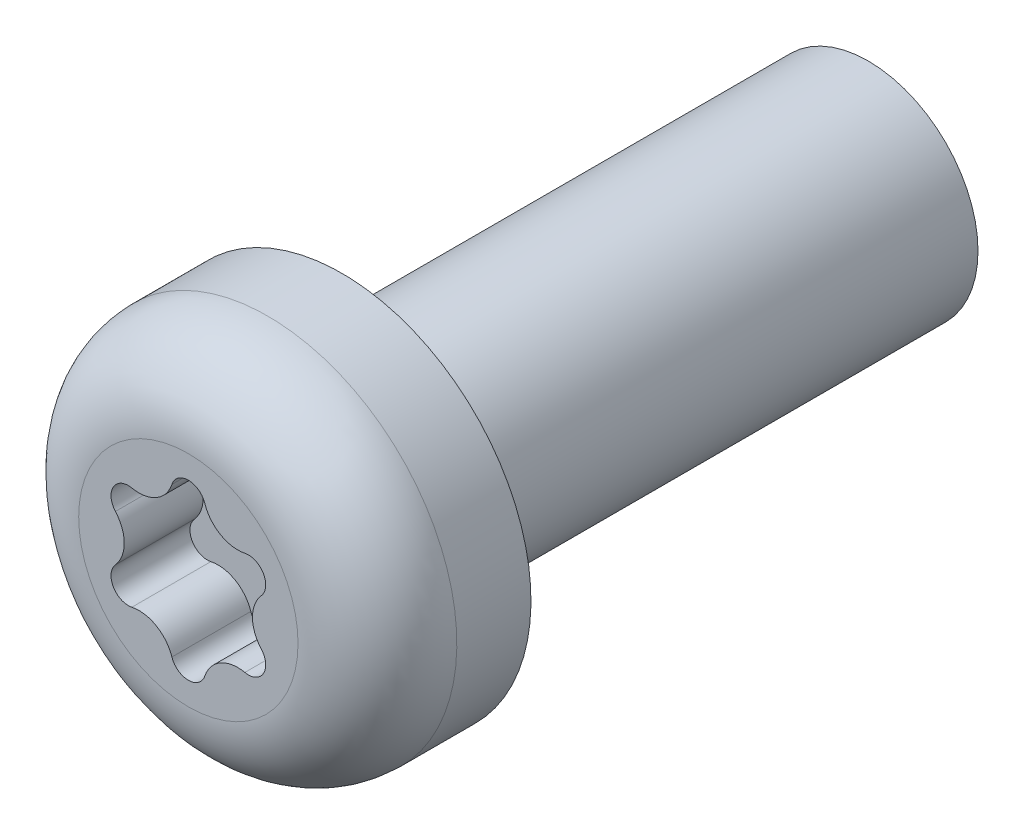
ISO-10303-21;
HEADER;
FILE_DESCRIPTION(('STEP AP214'),'2;1');
FILE_NAME('part.step','',(''),(''),'','','');
FILE_SCHEMA(('AUTOMOTIVE_DESIGN { 1 0 10303 214 1 1 1 1 }'));
ENDSEC;
DATA;
#1=APPLICATION_CONTEXT('core data for automotive mechanical design processes');
#2=APPLICATION_PROTOCOL_DEFINITION('international standard','automotive_design',2000,#1);
#3=PRODUCT_CONTEXT('',#1,'mechanical');
#4=PRODUCT('Part','Part','',(#3));
#5=PRODUCT_RELATED_PRODUCT_CATEGORY('part','',(#4));
#6=PRODUCT_DEFINITION_FORMATION('','',#4);
#7=PRODUCT_DEFINITION_CONTEXT('part definition',#1,'design');
#8=PRODUCT_DEFINITION('design','',#6,#7);
#9=PRODUCT_DEFINITION_SHAPE('','',#8);
#10=(LENGTH_UNIT() NAMED_UNIT(*) SI_UNIT(.MILLI.,.METRE.));
#11=(NAMED_UNIT(*) PLANE_ANGLE_UNIT() SI_UNIT($,.RADIAN.));
#12=(NAMED_UNIT(*) SI_UNIT($,.STERADIAN.) SOLID_ANGLE_UNIT());
#13=UNCERTAINTY_MEASURE_WITH_UNIT(LENGTH_MEASURE(1.E-05),#10,'distance_accuracy_value','');
#14=(GEOMETRIC_REPRESENTATION_CONTEXT(3) GLOBAL_UNCERTAINTY_ASSIGNED_CONTEXT((#13)) GLOBAL_UNIT_ASSIGNED_CONTEXT((#10,
#11,#12)) REPRESENTATION_CONTEXT('',''));
#15=CARTESIAN_POINT('',(0.,0.,0.));
#16=DIRECTION('',(0.,0.,1.));
#17=DIRECTION('',(1.,0.,0.));
#18=AXIS2_PLACEMENT_3D('',#15,#16,#17);
#19=CARTESIAN_POINT('',(0.,2.5,-12.));
#20=DIRECTION('',(0.,0.,1.));
#21=DIRECTION('',(0.,-1.,0.));
#22=AXIS2_PLACEMENT_3D('',#19,#20,#21);
#23=PLANE('',#22);
#24=CARTESIAN_POINT('',(0.,0.,-12.));
#25=DIRECTION('',(0.,0.,1.));
#26=DIRECTION('',(0.,-1.,0.));
#27=AXIS2_PLACEMENT_3D('',#24,#25,#26);
#28=CIRCLE('',#27,2.5);
#29=CARTESIAN_POINT('',(0.,-2.5,-12.));
#30=VERTEX_POINT('',#29);
#31=EDGE_CURVE('E11',#30,#30,#28,.T.);
#32=ORIENTED_EDGE('',*,*,#31,.F.);
#33=EDGE_LOOP('',(#32));
#34=FACE_BOUND('',#33,.T.);
#35=ADVANCED_FACE('F36',(#34),#23,.F.);
#36=CARTESIAN_POINT('',(0.,0.,5.58488227818494));
#37=DIRECTION('',(0.,0.,1.));
#38=DIRECTION('',(0.,-1.,0.));
#39=AXIS2_PLACEMENT_3D('',#36,#37,#38);
#40=CYLINDRICAL_SURFACE('',#39,2.5);
#41=CARTESIAN_POINT('',(0.,0.,0.));
#42=DIRECTION('',(0.,0.,1.));
#43=DIRECTION('',(0.,-1.,0.));
#44=AXIS2_PLACEMENT_3D('',#41,#42,#43);
#45=CIRCLE('',#44,2.5);
#46=CARTESIAN_POINT('',(0.,-2.5,0.));
#47=VERTEX_POINT('',#46);
#48=EDGE_CURVE('E44',#47,#47,#45,.T.);
#49=ORIENTED_EDGE('',*,*,#48,.F.);
#50=EDGE_LOOP('',(#49));
#51=FACE_BOUND('',#50,.T.);
#52=ORIENTED_EDGE('',*,*,#31,.T.);
#53=EDGE_LOOP('',(#52));
#54=FACE_BOUND('',#53,.T.);
#55=ADVANCED_FACE('F145',(#51,#54),#40,.T.);
#56=CARTESIAN_POINT('',(0.,4.31,0.));
#57=DIRECTION('',(0.,0.,1.));
#58=DIRECTION('',(0.,-1.,0.));
#59=AXIS2_PLACEMENT_3D('',#56,#57,#58);
#60=PLANE('',#59);
#61=CARTESIAN_POINT('',(0.,0.,0.));
#62=DIRECTION('',(0.,0.,1.));
#63=DIRECTION('',(0.,-1.,0.));
#64=AXIS2_PLACEMENT_3D('',#61,#62,#63);
#65=CIRCLE('',#64,4.31);
#66=CARTESIAN_POINT('',(0.,-4.31,0.));
#67=VERTEX_POINT('',#66);
#68=EDGE_CURVE('E138',#67,#67,#65,.T.);
#69=ORIENTED_EDGE('',*,*,#68,.F.);
#70=EDGE_LOOP('',(#69));
#71=FACE_BOUND('',#70,.T.);
#72=ORIENTED_EDGE('',*,*,#48,.T.);
#73=EDGE_LOOP('',(#72));
#74=FACE_BOUND('',#73,.T.);
#75=ADVANCED_FACE('F143',(#71,#74),#60,.F.);
#76=CARTESIAN_POINT('',(0.,0.,5.58488227818494));
#77=DIRECTION('',(0.,0.,1.));
#78=DIRECTION('',(0.,-1.,0.));
#79=AXIS2_PLACEMENT_3D('',#76,#77,#78);
#80=CYLINDRICAL_SURFACE('',#79,4.31);
#81=CARTESIAN_POINT('',(0.,0.,1.69));
#82=DIRECTION('',(0.,0.,1.));
#83=DIRECTION('',(0.,-1.,0.));
#84=AXIS2_PLACEMENT_3D('',#81,#82,#83);
#85=CIRCLE('',#84,4.31);
#86=CARTESIAN_POINT('',(0.,-4.31,1.69));
#87=VERTEX_POINT('',#86);
#88=EDGE_CURVE('E135',#87,#87,#85,.T.);
#89=ORIENTED_EDGE('',*,*,#88,.F.);
#90=EDGE_LOOP('',(#89));
#91=FACE_BOUND('',#90,.T.);
#92=ORIENTED_EDGE('',*,*,#68,.T.);
#93=EDGE_LOOP('',(#92));
#94=FACE_BOUND('',#93,.T.);
#95=ADVANCED_FACE('F163',(#91,#94),#80,.T.);
#96=CARTESIAN_POINT('',(0.,0.,1.69));
#97=DIRECTION('',(0.,0.,1.));
#98=DIRECTION('',(0.,-1.,0.));
#99=AXIS2_PLACEMENT_3D('',#96,#97,#98);
#100=TOROIDAL_SURFACE('',#99,2.5,1.81);
#101=CARTESIAN_POINT('',(0.,0.,3.5));
#102=DIRECTION('',(0.,0.,1.));
#103=DIRECTION('',(0.,-1.,0.));
#104=AXIS2_PLACEMENT_3D('',#101,#102,#103);
#105=CIRCLE('',#104,2.5);
#106=CARTESIAN_POINT('',(0.,-2.5,3.5));
#107=VERTEX_POINT('',#106);
#108=EDGE_CURVE('E131',#107,#107,#105,.T.);
#109=ORIENTED_EDGE('',*,*,#108,.F.);
#110=EDGE_LOOP('',(#109));
#111=FACE_BOUND('',#110,.T.);
#112=ORIENTED_EDGE('',*,*,#88,.T.);
#113=EDGE_LOOP('',(#112));
#114=FACE_BOUND('',#113,.T.);
#115=ADVANCED_FACE('F171',(#111,#114),#100,.T.);
#116=CARTESIAN_POINT('',(0.,0.,3.5));
#117=DIRECTION('',(0.,0.,-1.));
#118=DIRECTION('',(0.,1.,0.));
#119=AXIS2_PLACEMENT_3D('',#116,#117,#118);
#120=PLANE('',#119);
#121=CARTESIAN_POINT('',(-1.36832013797942,0.789999999999997,3.5));
#122=DIRECTION('',(0.,0.,1.));
#123=DIRECTION('',(-0.499999999999998,-0.86602540378444,0.));
#124=AXIS2_PLACEMENT_3D('',#121,#122,#123);
#125=CIRCLE('',#124,0.395);
#126=CARTESIAN_POINT('',(-1.28747459016825,1.17663807029199,3.5));
#127=VERTEX_POINT('',#126);
#128=CARTESIAN_POINT('',(-1.66273575501689,0.526666666666665,3.5));
#129=VERTEX_POINT('',#128);
#130=EDGE_CURVE('E95',#127,#129,#125,.T.);
#131=ORIENTED_EDGE('',*,*,#130,.F.);
#132=CARTESIAN_POINT('',(-1.12578349454591,1.94991421087597,3.5));
#133=DIRECTION('',(0.,0.,-1.));
#134=DIRECTION('',(1.,0.,0.));
#135=AXIS2_PLACEMENT_3D('',#132,#133,#134);
#136=CIRCLE('',#135,0.79);
#137=CARTESIAN_POINT('',(-0.375261164848638,1.70330473695866,3.5));
#138=VERTEX_POINT('',#137);
#139=EDGE_CURVE('E90',#138,#127,#136,.T.);
#140=ORIENTED_EDGE('',*,*,#139,.F.);
#141=CARTESIAN_POINT('',(0.,1.58,3.5));
#142=DIRECTION('',(0.,0.,1.));
#143=DIRECTION('',(-1.,0.,0.));
#144=AXIS2_PLACEMENT_3D('',#141,#142,#143);
#145=CIRCLE('',#144,0.395);
#146=CARTESIAN_POINT('',(0.375261164848638,1.70330473695866,3.5));
#147=VERTEX_POINT('',#146);
#148=EDGE_CURVE('E120',#147,#138,#145,.T.);
#149=ORIENTED_EDGE('',*,*,#148,.F.);
#150=CARTESIAN_POINT('',(1.12578349454591,1.94991421087597,3.5));
#151=DIRECTION('',(0.,0.,-1.));
#152=DIRECTION('',(1.,0.,0.));
#153=AXIS2_PLACEMENT_3D('',#150,#151,#152);
#154=CIRCLE('',#153,0.79);
#155=CARTESIAN_POINT('',(1.28747459016824,1.176638070292,3.5));
#156=VERTEX_POINT('',#155);
#157=EDGE_CURVE('E127',#156,#147,#154,.T.);
#158=ORIENTED_EDGE('',*,*,#157,.F.);
#159=CARTESIAN_POINT('',(1.3683201379794,0.790000000000016,3.5));
#160=DIRECTION('',(0.,0.,1.));
#161=DIRECTION('',(-0.50000000000001,0.866025403784433,0.));
#162=AXIS2_PLACEMENT_3D('',#159,#160,#161);
#163=CIRCLE('',#162,0.395);
#164=CARTESIAN_POINT('',(1.66273575501688,0.526666666666688,3.5));
#165=VERTEX_POINT('',#164);
#166=EDGE_CURVE('E353',#165,#156,#163,.T.);
#167=ORIENTED_EDGE('',*,*,#166,.F.);
#168=CARTESIAN_POINT('',(2.25156698909184,0.,3.5));
#169=DIRECTION('',(0.,0.,-1.));
#170=DIRECTION('',(-0.499999999999992,-0.866025403784443,0.));
#171=AXIS2_PLACEMENT_3D('',#168,#169,#170);
#172=CIRCLE('',#171,0.79);
#173=CARTESIAN_POINT('',(1.66273575501689,-0.526666666666654,3.5));
#174=VERTEX_POINT('',#173);
#175=EDGE_CURVE('E371',#174,#165,#172,.T.);
#176=ORIENTED_EDGE('',*,*,#175,.F.);
#177=CARTESIAN_POINT('',(1.36832013797942,-0.789999999999988,3.5));
#178=DIRECTION('',(0.,0.,1.));
#179=DIRECTION('',(0.499999999999992,0.866025403784443,0.));
#180=AXIS2_PLACEMENT_3D('',#177,#178,#179);
#181=CIRCLE('',#180,0.395);
#182=CARTESIAN_POINT('',(1.28747459016826,-1.17663807029198,3.5));
#183=VERTEX_POINT('',#182);
#184=EDGE_CURVE('E377',#183,#174,#181,.T.);
#185=ORIENTED_EDGE('',*,*,#184,.F.);
#186=CARTESIAN_POINT('',(1.12578349454591,-1.94991421087597,3.5));
#187=DIRECTION('',(0.,0.,-1.));
#188=DIRECTION('',(-1.,0.,0.));
#189=AXIS2_PLACEMENT_3D('',#186,#187,#188);
#190=CIRCLE('',#189,0.79);
#191=CARTESIAN_POINT('',(0.375261164848638,-1.70330473695866,3.5));
#192=VERTEX_POINT('',#191);
#193=EDGE_CURVE('E388',#192,#183,#190,.T.);
#194=ORIENTED_EDGE('',*,*,#193,.F.);
#195=CARTESIAN_POINT('',(0.,-1.58,3.5));
#196=DIRECTION('',(0.,0.,1.));
#197=DIRECTION('',(1.,0.,0.));
#198=AXIS2_PLACEMENT_3D('',#195,#196,#197);
#199=CIRCLE('',#198,0.395);
#200=CARTESIAN_POINT('',(-0.375261164848638,-1.70330473695866,3.5));
#201=VERTEX_POINT('',#200);
#202=EDGE_CURVE('E395',#201,#192,#199,.T.);
#203=ORIENTED_EDGE('',*,*,#202,.F.);
#204=CARTESIAN_POINT('',(-1.12578349454591,-1.94991421087597,3.5));
#205=DIRECTION('',(0.,0.,-1.));
#206=DIRECTION('',(-0.500000000000004,0.866025403784436,0.));
#207=AXIS2_PLACEMENT_3D('',#204,#205,#206);
#208=CIRCLE('',#207,0.79);
#209=CARTESIAN_POINT('',(-1.28747459016824,-1.176638070292,3.5));
#210=VERTEX_POINT('',#209);
#211=EDGE_CURVE('E406',#210,#201,#208,.T.);
#212=ORIENTED_EDGE('',*,*,#211,.F.);
#213=CARTESIAN_POINT('',(-1.36832013797941,-0.790000000000007,3.5));
#214=DIRECTION('',(0.,0.,1.));
#215=DIRECTION('',(0.500000000000004,-0.866025403784436,0.));
#216=AXIS2_PLACEMENT_3D('',#213,#214,#215);
#217=CIRCLE('',#216,0.395);
#218=CARTESIAN_POINT('',(-1.66273575501689,-0.526666666666677,3.5));
#219=VERTEX_POINT('',#218);
#220=EDGE_CURVE('E106',#219,#210,#217,.T.);
#221=ORIENTED_EDGE('',*,*,#220,.F.);
#222=CARTESIAN_POINT('',(-2.25156698909184,0.,3.5));
#223=DIRECTION('',(0.,0.,-1.));
#224=DIRECTION('',(0.499999999999998,0.86602540378444,0.));
#225=AXIS2_PLACEMENT_3D('',#222,#223,#224);
#226=CIRCLE('',#225,0.79);
#227=EDGE_CURVE('E85',#129,#219,#226,.T.);
#228=ORIENTED_EDGE('',*,*,#227,.F.);
#229=EDGE_LOOP('',(#131,#140,#149,#158,#167,#176,#185,#194,#203,#212,#221,#228));
#230=FACE_BOUND('',#229,.T.);
#231=ORIENTED_EDGE('',*,*,#108,.T.);
#232=EDGE_LOOP('',(#231));
#233=FACE_BOUND('',#232,.T.);
#234=ADVANCED_FACE('F102',(#230,#233),#120,.F.);
#235=CARTESIAN_POINT('',(-1.12578349454591,1.94991421087597,1.7));
#236=DIRECTION('',(0.,0.,1.));
#237=DIRECTION('',(1.,0.,0.));
#238=AXIS2_PLACEMENT_3D('',#235,#236,#237);
#239=CYLINDRICAL_SURFACE('',#238,0.79);
#240=ORIENTED_EDGE('',*,*,#139,.T.);
#241=DIRECTION('',(0.,0.,1.));
#242=VECTOR('',#241,1.);
#243=CARTESIAN_POINT('',(-1.28747459016825,1.17663807029199,1.7));
#244=LINE('',#243,#242);
#245=CARTESIAN_POINT('',(-1.28747459016825,1.17663807029199,1.7));
#246=VERTEX_POINT('',#245);
#247=EDGE_CURVE('E91',#246,#127,#244,.T.);
#248=ORIENTED_EDGE('',*,*,#247,.F.);
#249=CARTESIAN_POINT('',(-1.12578349454591,1.94991421087597,1.7));
#250=DIRECTION('',(0.,0.,-1.));
#251=DIRECTION('',(1.,0.,0.));
#252=AXIS2_PLACEMENT_3D('',#249,#250,#251);
#253=CIRCLE('',#252,0.79);
#254=CARTESIAN_POINT('',(-0.375261164848638,1.70330473695866,1.7));
#255=VERTEX_POINT('',#254);
#256=EDGE_CURVE('E117',#255,#246,#253,.T.);
#257=ORIENTED_EDGE('',*,*,#256,.F.);
#258=DIRECTION('',(0.,0.,1.));
#259=VECTOR('',#258,1.);
#260=CARTESIAN_POINT('',(-0.375261164848638,1.70330473695866,1.7));
#261=LINE('',#260,#259);
#262=EDGE_CURVE('E52',#255,#138,#261,.T.);
#263=ORIENTED_EDGE('',*,*,#262,.T.);
#264=EDGE_LOOP('',(#240,#248,#257,#263));
#265=FACE_BOUND('',#264,.T.);
#266=ADVANCED_FACE('F187',(#265),#239,.T.);
#267=CARTESIAN_POINT('',(0.,1.58,1.7));
#268=DIRECTION('',(0.,0.,1.));
#269=DIRECTION('',(1.,0.,0.));
#270=AXIS2_PLACEMENT_3D('',#267,#268,#269);
#271=CYLINDRICAL_SURFACE('',#270,0.395);
#272=ORIENTED_EDGE('',*,*,#148,.T.);
#273=ORIENTED_EDGE('',*,*,#262,.F.);
#274=CARTESIAN_POINT('',(0.,1.58,1.7));
#275=DIRECTION('',(0.,0.,1.));
#276=DIRECTION('',(-1.,0.,0.));
#277=AXIS2_PLACEMENT_3D('',#274,#275,#276);
#278=CIRCLE('',#277,0.395);
#279=CARTESIAN_POINT('',(0.375261164848638,1.70330473695866,1.7));
#280=VERTEX_POINT('',#279);
#281=EDGE_CURVE('E123',#280,#255,#278,.T.);
#282=ORIENTED_EDGE('',*,*,#281,.F.);
#283=DIRECTION('',(0.,0.,1.));
#284=VECTOR('',#283,1.);
#285=CARTESIAN_POINT('',(0.375261164848638,1.70330473695866,1.7));
#286=LINE('',#285,#284);
#287=EDGE_CURVE('E60',#280,#147,#286,.T.);
#288=ORIENTED_EDGE('',*,*,#287,.T.);
#289=EDGE_LOOP('',(#272,#273,#282,#288));
#290=FACE_BOUND('',#289,.T.);
#291=ADVANCED_FACE('F194',(#290),#271,.F.);
#292=CARTESIAN_POINT('',(1.12578349454591,1.94991421087597,1.7));
#293=DIRECTION('',(0.,0.,1.));
#294=DIRECTION('',(1.,0.,0.));
#295=AXIS2_PLACEMENT_3D('',#292,#293,#294);
#296=CYLINDRICAL_SURFACE('',#295,0.79);
#297=ORIENTED_EDGE('',*,*,#157,.T.);
#298=ORIENTED_EDGE('',*,*,#287,.F.);
#299=CARTESIAN_POINT('',(1.12578349454591,1.94991421087597,1.7));
#300=DIRECTION('',(0.,0.,-1.));
#301=DIRECTION('',(1.,0.,0.));
#302=AXIS2_PLACEMENT_3D('',#299,#300,#301);
#303=CIRCLE('',#302,0.79);
#304=CARTESIAN_POINT('',(1.28747459016824,1.176638070292,1.7));
#305=VERTEX_POINT('',#304);
#306=EDGE_CURVE('E119',#305,#280,#303,.T.);
#307=ORIENTED_EDGE('',*,*,#306,.F.);
#308=DIRECTION('',(0.,0.,1.));
#309=VECTOR('',#308,1.);
#310=CARTESIAN_POINT('',(1.28747459016824,1.176638070292,1.7));
#311=LINE('',#310,#309);
#312=EDGE_CURVE('E357',#305,#156,#311,.T.);
#313=ORIENTED_EDGE('',*,*,#312,.T.);
#314=EDGE_LOOP('',(#297,#298,#307,#313));
#315=FACE_BOUND('',#314,.T.);
#316=ADVANCED_FACE('F202',(#315),#296,.T.);
#317=CARTESIAN_POINT('',(-1.12578349454591,1.94991421087597,1.7));
#318=DIRECTION('',(0.,0.,1.));
#319=DIRECTION('',(1.,0.,0.));
#320=AXIS2_PLACEMENT_3D('',#317,#318,#319);
#321=PLANE('',#320);
#322=ORIENTED_EDGE('',*,*,#256,.T.);
#323=CARTESIAN_POINT('',(-1.36832013797941,0.789999999999997,1.7));
#324=DIRECTION('',(0.,0.,1.));
#325=DIRECTION('',(-0.499999999999998,-0.86602540378444,0.));
#326=AXIS2_PLACEMENT_3D('',#323,#324,#325);
#327=CIRCLE('',#326,0.395);
#328=CARTESIAN_POINT('',(-1.66273575501689,0.526666666666665,1.7));
#329=VERTEX_POINT('',#328);
#330=EDGE_CURVE('E113',#246,#329,#327,.T.);
#331=ORIENTED_EDGE('',*,*,#330,.T.);
#332=CARTESIAN_POINT('',(-2.25156698909184,0.,1.7));
#333=DIRECTION('',(0.,0.,-1.));
#334=DIRECTION('',(0.499999999999998,0.86602540378444,0.));
#335=AXIS2_PLACEMENT_3D('',#332,#333,#334);
#336=CIRCLE('',#335,0.79);
#337=CARTESIAN_POINT('',(-1.66273575501689,-0.526666666666677,1.7));
#338=VERTEX_POINT('',#337);
#339=EDGE_CURVE('E88',#329,#338,#336,.T.);
#340=ORIENTED_EDGE('',*,*,#339,.T.);
#341=CARTESIAN_POINT('',(-1.36832013797941,-0.790000000000007,1.7));
#342=DIRECTION('',(0.,0.,1.));
#343=DIRECTION('',(0.500000000000004,-0.866025403784436,0.));
#344=AXIS2_PLACEMENT_3D('',#341,#342,#343);
#345=CIRCLE('',#344,0.395);
#346=CARTESIAN_POINT('',(-1.28747459016824,-1.176638070292,1.7));
#347=VERTEX_POINT('',#346);
#348=EDGE_CURVE('E412',#338,#347,#345,.T.);
#349=ORIENTED_EDGE('',*,*,#348,.T.);
#350=CARTESIAN_POINT('',(-1.12578349454591,-1.94991421087597,1.7));
#351=DIRECTION('',(0.,0.,-1.));
#352=DIRECTION('',(-0.500000000000004,0.866025403784436,0.));
#353=AXIS2_PLACEMENT_3D('',#350,#351,#352);
#354=CIRCLE('',#353,0.79);
#355=CARTESIAN_POINT('',(-0.375261164848638,-1.70330473695866,1.7));
#356=VERTEX_POINT('',#355);
#357=EDGE_CURVE('E409',#347,#356,#354,.T.);
#358=ORIENTED_EDGE('',*,*,#357,.T.);
#359=CARTESIAN_POINT('',(0.,-1.58,1.7));
#360=DIRECTION('',(0.,0.,1.));
#361=DIRECTION('',(1.,0.,0.));
#362=AXIS2_PLACEMENT_3D('',#359,#360,#361);
#363=CIRCLE('',#362,0.395);
#364=CARTESIAN_POINT('',(0.375261164848638,-1.70330473695866,1.7));
#365=VERTEX_POINT('',#364);
#366=EDGE_CURVE('E394',#356,#365,#363,.T.);
#367=ORIENTED_EDGE('',*,*,#366,.T.);
#368=CARTESIAN_POINT('',(1.12578349454591,-1.94991421087597,1.7));
#369=DIRECTION('',(0.,0.,-1.));
#370=DIRECTION('',(-1.,0.,0.));
#371=AXIS2_PLACEMENT_3D('',#368,#369,#370);
#372=CIRCLE('',#371,0.79);
#373=CARTESIAN_POINT('',(1.28747459016826,-1.17663807029198,1.7));
#374=VERTEX_POINT('',#373);
#375=EDGE_CURVE('E391',#365,#374,#372,.T.);
#376=ORIENTED_EDGE('',*,*,#375,.T.);
#377=CARTESIAN_POINT('',(1.36832013797942,-0.789999999999988,1.7));
#378=DIRECTION('',(0.,0.,1.));
#379=DIRECTION('',(0.499999999999992,0.866025403784443,0.));
#380=AXIS2_PLACEMENT_3D('',#377,#378,#379);
#381=CIRCLE('',#380,0.395);
#382=CARTESIAN_POINT('',(1.66273575501689,-0.526666666666654,1.7));
#383=VERTEX_POINT('',#382);
#384=EDGE_CURVE('E376',#374,#383,#381,.T.);
#385=ORIENTED_EDGE('',*,*,#384,.T.);
#386=CARTESIAN_POINT('',(2.25156698909184,0.,1.7));
#387=DIRECTION('',(0.,0.,-1.));
#388=DIRECTION('',(-0.499999999999992,-0.866025403784443,0.));
#389=AXIS2_PLACEMENT_3D('',#386,#387,#388);
#390=CIRCLE('',#389,0.79);
#391=CARTESIAN_POINT('',(1.66273575501688,0.526666666666688,1.7));
#392=VERTEX_POINT('',#391);
#393=EDGE_CURVE('E373',#383,#392,#390,.T.);
#394=ORIENTED_EDGE('',*,*,#393,.T.);
#395=CARTESIAN_POINT('',(1.3683201379794,0.790000000000016,1.7));
#396=DIRECTION('',(0.,0.,1.));
#397=DIRECTION('',(-0.50000000000001,0.866025403784433,0.));
#398=AXIS2_PLACEMENT_3D('',#395,#396,#397);
#399=CIRCLE('',#398,0.395);
#400=EDGE_CURVE('E366',#392,#305,#399,.T.);
#401=ORIENTED_EDGE('',*,*,#400,.T.);
#402=ORIENTED_EDGE('',*,*,#306,.T.);
#403=ORIENTED_EDGE('',*,*,#281,.T.);
#404=EDGE_LOOP('',(#322,#331,#340,#349,#358,#367,#376,#385,#394,#401,#402,#403));
#405=FACE_BOUND('',#404,.T.);
#406=ADVANCED_FACE('F208',(#405),#321,.T.);
#407=CARTESIAN_POINT('',(-2.25156698909184,0.,1.7));
#408=DIRECTION('',(0.,0.,1.));
#409=DIRECTION('',(1.,0.,0.));
#410=AXIS2_PLACEMENT_3D('',#407,#408,#409);
#411=CYLINDRICAL_SURFACE('',#410,0.79);
#412=ORIENTED_EDGE('',*,*,#227,.T.);
#413=DIRECTION('',(0.,0.,1.));
#414=VECTOR('',#413,1.);
#415=CARTESIAN_POINT('',(-1.66273575501689,-0.526666666666677,1.7));
#416=LINE('',#415,#414);
#417=EDGE_CURVE('E110',#338,#219,#416,.T.);
#418=ORIENTED_EDGE('',*,*,#417,.F.);
#419=ORIENTED_EDGE('',*,*,#339,.F.);
#420=DIRECTION('',(0.,0.,1.));
#421=VECTOR('',#420,1.);
#422=CARTESIAN_POINT('',(-1.66273575501689,0.526666666666665,1.7));
#423=LINE('',#422,#421);
#424=EDGE_CURVE('E69',#329,#129,#423,.T.);
#425=ORIENTED_EDGE('',*,*,#424,.T.);
#426=EDGE_LOOP('',(#412,#418,#419,#425));
#427=FACE_BOUND('',#426,.T.);
#428=ADVANCED_FACE('F81',(#427),#411,.T.);
#429=CARTESIAN_POINT('',(-1.36832013797941,0.789999999999997,1.7));
#430=DIRECTION('',(0.,0.,1.));
#431=DIRECTION('',(1.,0.,0.));
#432=AXIS2_PLACEMENT_3D('',#429,#430,#431);
#433=CYLINDRICAL_SURFACE('',#432,0.395);
#434=ORIENTED_EDGE('',*,*,#130,.T.);
#435=ORIENTED_EDGE('',*,*,#424,.F.);
#436=ORIENTED_EDGE('',*,*,#330,.F.);
#437=ORIENTED_EDGE('',*,*,#247,.T.);
#438=EDGE_LOOP('',(#434,#435,#436,#437));
#439=FACE_BOUND('',#438,.T.);
#440=ADVANCED_FACE('F96',(#439),#433,.F.);
#441=CARTESIAN_POINT('',(-1.12578349454591,-1.94991421087597,1.7));
#442=DIRECTION('',(0.,0.,1.));
#443=DIRECTION('',(0.,-1.,0.));
#444=AXIS2_PLACEMENT_3D('',#441,#442,#443);
#445=CYLINDRICAL_SURFACE('',#444,0.79);
#446=ORIENTED_EDGE('',*,*,#211,.T.);
#447=DIRECTION('',(0.,0.,1.));
#448=VECTOR('',#447,1.);
#449=CARTESIAN_POINT('',(-0.375261164848638,-1.70330473695866,1.7));
#450=LINE('',#449,#448);
#451=EDGE_CURVE('E398',#356,#201,#450,.T.);
#452=ORIENTED_EDGE('',*,*,#451,.F.);
#453=ORIENTED_EDGE('',*,*,#357,.F.);
#454=DIRECTION('',(0.,0.,1.));
#455=VECTOR('',#454,1.);
#456=CARTESIAN_POINT('',(-1.28747459016824,-1.176638070292,1.7));
#457=LINE('',#456,#455);
#458=EDGE_CURVE('E107',#347,#210,#457,.T.);
#459=ORIENTED_EDGE('',*,*,#458,.T.);
#460=EDGE_LOOP('',(#446,#452,#453,#459));
#461=FACE_BOUND('',#460,.T.);
#462=ADVANCED_FACE('F229',(#461),#445,.T.);
#463=CARTESIAN_POINT('',(-1.36832013797941,-0.790000000000007,1.7));
#464=DIRECTION('',(0.,0.,1.));
#465=DIRECTION('',(0.,-1.,0.));
#466=AXIS2_PLACEMENT_3D('',#463,#464,#465);
#467=CYLINDRICAL_SURFACE('',#466,0.395);
#468=ORIENTED_EDGE('',*,*,#220,.T.);
#469=ORIENTED_EDGE('',*,*,#458,.F.);
#470=ORIENTED_EDGE('',*,*,#348,.F.);
#471=ORIENTED_EDGE('',*,*,#417,.T.);
#472=EDGE_LOOP('',(#468,#469,#470,#471));
#473=FACE_BOUND('',#472,.T.);
#474=ADVANCED_FACE('F236',(#473),#467,.F.);
#475=CARTESIAN_POINT('',(1.12578349454591,-1.94991421087597,1.7));
#476=DIRECTION('',(0.,0.,1.));
#477=DIRECTION('',(0.,-1.,0.));
#478=AXIS2_PLACEMENT_3D('',#475,#476,#477);
#479=CYLINDRICAL_SURFACE('',#478,0.79);
#480=ORIENTED_EDGE('',*,*,#193,.T.);
#481=DIRECTION('',(0.,0.,1.));
#482=VECTOR('',#481,1.);
#483=CARTESIAN_POINT('',(1.28747459016826,-1.17663807029198,1.7));
#484=LINE('',#483,#482);
#485=EDGE_CURVE('E380',#374,#183,#484,.T.);
#486=ORIENTED_EDGE('',*,*,#485,.F.);
#487=ORIENTED_EDGE('',*,*,#375,.F.);
#488=DIRECTION('',(0.,0.,1.));
#489=VECTOR('',#488,1.);
#490=CARTESIAN_POINT('',(0.375261164848638,-1.70330473695866,1.7));
#491=LINE('',#490,#489);
#492=EDGE_CURVE('E403',#365,#192,#491,.T.);
#493=ORIENTED_EDGE('',*,*,#492,.T.);
#494=EDGE_LOOP('',(#480,#486,#487,#493));
#495=FACE_BOUND('',#494,.T.);
#496=ADVANCED_FACE('F244',(#495),#479,.T.);
#497=CARTESIAN_POINT('',(0.,-1.58,1.7));
#498=DIRECTION('',(0.,0.,1.));
#499=DIRECTION('',(0.,-1.,0.));
#500=AXIS2_PLACEMENT_3D('',#497,#498,#499);
#501=CYLINDRICAL_SURFACE('',#500,0.395);
#502=ORIENTED_EDGE('',*,*,#202,.T.);
#503=ORIENTED_EDGE('',*,*,#492,.F.);
#504=ORIENTED_EDGE('',*,*,#366,.F.);
#505=ORIENTED_EDGE('',*,*,#451,.T.);
#506=EDGE_LOOP('',(#502,#503,#504,#505));
#507=FACE_BOUND('',#506,.T.);
#508=ADVANCED_FACE('F252',(#507),#501,.F.);
#509=CARTESIAN_POINT('',(2.25156698909184,0.,1.7));
#510=DIRECTION('',(0.,0.,1.));
#511=DIRECTION('',(0.,-1.,0.));
#512=AXIS2_PLACEMENT_3D('',#509,#510,#511);
#513=CYLINDRICAL_SURFACE('',#512,0.79);
#514=ORIENTED_EDGE('',*,*,#175,.T.);
#515=DIRECTION('',(0.,0.,1.));
#516=VECTOR('',#515,1.);
#517=CARTESIAN_POINT('',(1.66273575501688,0.526666666666688,1.7));
#518=LINE('',#517,#516);
#519=EDGE_CURVE('E361',#392,#165,#518,.T.);
#520=ORIENTED_EDGE('',*,*,#519,.F.);
#521=ORIENTED_EDGE('',*,*,#393,.F.);
#522=DIRECTION('',(0.,0.,1.));
#523=VECTOR('',#522,1.);
#524=CARTESIAN_POINT('',(1.66273575501689,-0.526666666666654,1.7));
#525=LINE('',#524,#523);
#526=EDGE_CURVE('E385',#383,#174,#525,.T.);
#527=ORIENTED_EDGE('',*,*,#526,.T.);
#528=EDGE_LOOP('',(#514,#520,#521,#527));
#529=FACE_BOUND('',#528,.T.);
#530=ADVANCED_FACE('F260',(#529),#513,.T.);
#531=CARTESIAN_POINT('',(1.36832013797942,-0.789999999999988,1.7));
#532=DIRECTION('',(0.,0.,1.));
#533=DIRECTION('',(0.,-1.,0.));
#534=AXIS2_PLACEMENT_3D('',#531,#532,#533);
#535=CYLINDRICAL_SURFACE('',#534,0.395);
#536=ORIENTED_EDGE('',*,*,#184,.T.);
#537=ORIENTED_EDGE('',*,*,#526,.F.);
#538=ORIENTED_EDGE('',*,*,#384,.F.);
#539=ORIENTED_EDGE('',*,*,#485,.T.);
#540=EDGE_LOOP('',(#536,#537,#538,#539));
#541=FACE_BOUND('',#540,.T.);
#542=ADVANCED_FACE('F268',(#541),#535,.F.);
#543=CARTESIAN_POINT('',(1.3683201379794,0.790000000000016,1.7));
#544=DIRECTION('',(0.,0.,1.));
#545=DIRECTION('',(1.,0.,0.));
#546=AXIS2_PLACEMENT_3D('',#543,#544,#545);
#547=CYLINDRICAL_SURFACE('',#546,0.395);
#548=ORIENTED_EDGE('',*,*,#166,.T.);
#549=ORIENTED_EDGE('',*,*,#312,.F.);
#550=ORIENTED_EDGE('',*,*,#400,.F.);
#551=ORIENTED_EDGE('',*,*,#519,.T.);
#552=EDGE_LOOP('',(#548,#549,#550,#551));
#553=FACE_BOUND('',#552,.T.);
#554=ADVANCED_FACE('F276',(#553),#547,.F.);
#555=CLOSED_SHELL('',(#35,#55,#75,#95,#115,#234,#266,#291,#316,#406,#428,#440,#462,#474,#496,
#508,#530,#542,#554));
#556=MANIFOLD_SOLID_BREP('B2',#555);
#557=ADVANCED_BREP_SHAPE_REPRESENTATION('',(#18,#556),#14);
#558=SHAPE_DEFINITION_REPRESENTATION(#9,#557);
ENDSEC;
END-ISO-10303-21;
